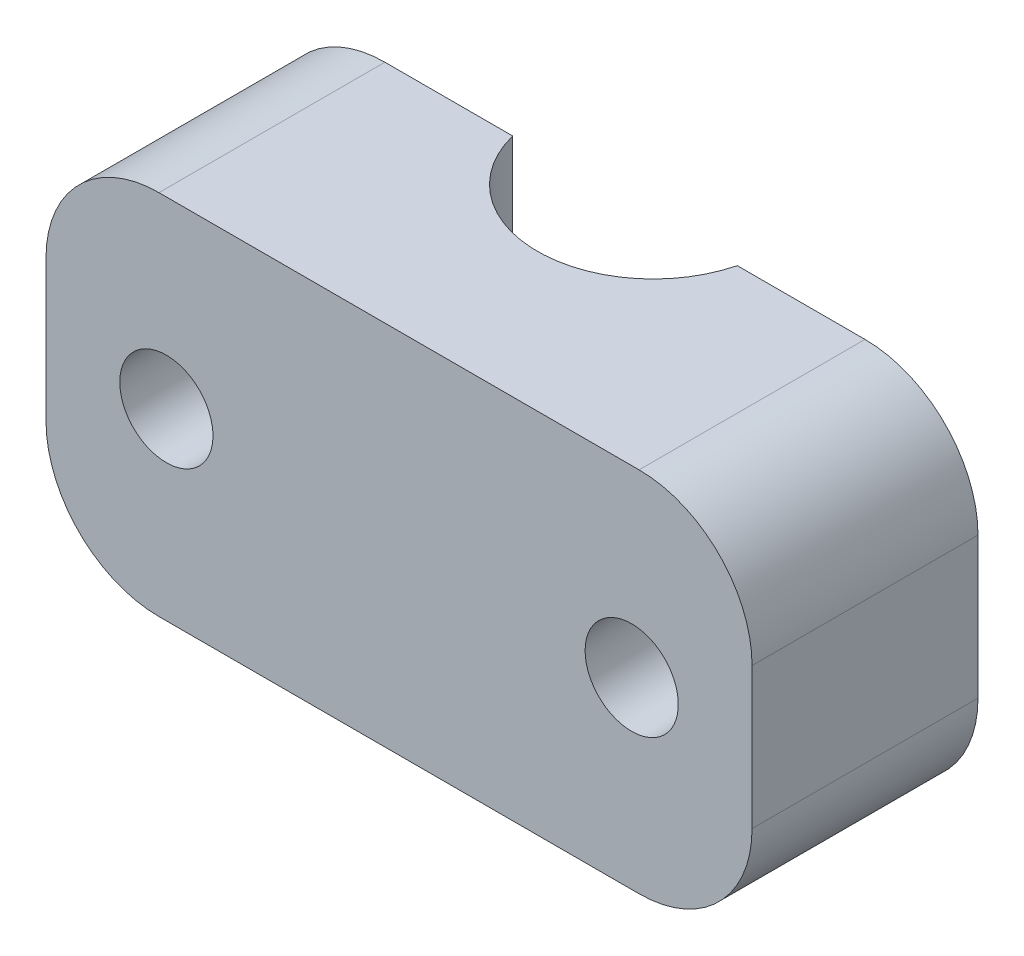
ISO-10303-21;
HEADER;
FILE_DESCRIPTION(('STEP AP214'),'2;1');
FILE_NAME('part.step','',(''),(''),'','','');
FILE_SCHEMA(('AUTOMOTIVE_DESIGN { 1 0 10303 214 1 1 1 1 }'));
ENDSEC;
DATA;
#1=APPLICATION_CONTEXT('core data for automotive mechanical design processes');
#2=APPLICATION_PROTOCOL_DEFINITION('international standard','automotive_design',2000,#1);
#3=PRODUCT_CONTEXT('',#1,'mechanical');
#4=PRODUCT('Part','Part','',(#3));
#5=PRODUCT_RELATED_PRODUCT_CATEGORY('part','',(#4));
#6=PRODUCT_DEFINITION_FORMATION('','',#4);
#7=PRODUCT_DEFINITION_CONTEXT('part definition',#1,'design');
#8=PRODUCT_DEFINITION('design','',#6,#7);
#9=PRODUCT_DEFINITION_SHAPE('','',#8);
#10=(LENGTH_UNIT() NAMED_UNIT(*) SI_UNIT(.MILLI.,.METRE.));
#11=(NAMED_UNIT(*) PLANE_ANGLE_UNIT() SI_UNIT($,.RADIAN.));
#12=(NAMED_UNIT(*) SI_UNIT($,.STERADIAN.) SOLID_ANGLE_UNIT());
#13=UNCERTAINTY_MEASURE_WITH_UNIT(LENGTH_MEASURE(1.E-05),#10,'distance_accuracy_value','');
#14=(GEOMETRIC_REPRESENTATION_CONTEXT(3) GLOBAL_UNCERTAINTY_ASSIGNED_CONTEXT((#13)) GLOBAL_UNIT_ASSIGNED_CONTEXT((#10,
#11,#12)) REPRESENTATION_CONTEXT('',''));
#15=CARTESIAN_POINT('',(0.,0.,0.));
#16=DIRECTION('',(0.,0.,1.));
#17=DIRECTION('',(1.,0.,0.));
#18=AXIS2_PLACEMENT_3D('',#15,#16,#17);
#19=CARTESIAN_POINT('',(-12.5,13.,-4.));
#20=DIRECTION('',(0.,0.,1.));
#21=DIRECTION('',(1.,0.,0.));
#22=AXIS2_PLACEMENT_3D('',#19,#20,#21);
#23=PLANE('',#22);
#24=CARTESIAN_POINT('',(8.23808953520711,6.5,-4.));
#25=DIRECTION('',(0.,0.,-1.));
#26=DIRECTION('',(-1.,0.,0.));
#27=AXIS2_PLACEMENT_3D('',#24,#25,#26);
#28=CIRCLE('',#27,1.65);
#29=CARTESIAN_POINT('',(6.5880895352071,6.5,-4.));
#30=VERTEX_POINT('',#29);
#31=EDGE_CURVE('E255',#30,#30,#28,.T.);
#32=ORIENTED_EDGE('',*,*,#31,.F.);
#33=EDGE_LOOP('',(#32));
#34=FACE_BOUND('',#33,.T.);
#35=DIRECTION('',(-1.,0.,0.));
#36=VECTOR('',#35,1.);
#37=CARTESIAN_POINT('',(-12.5,13.,-4.));
#38=LINE('',#37,#36);
#39=CARTESIAN_POINT('',(8.5,13.,-4.));
#40=VERTEX_POINT('',#39);
#41=CARTESIAN_POINT('',(3.97617907041421,13.,-4.));
#42=VERTEX_POINT('',#41);
#43=EDGE_CURVE('E250',#40,#42,#38,.T.);
#44=ORIENTED_EDGE('',*,*,#43,.F.);
#45=CARTESIAN_POINT('',(8.5,9.,-4.));
#46=DIRECTION('',(0.,0.,1.));
#47=DIRECTION('',(1.,0.,0.));
#48=AXIS2_PLACEMENT_3D('',#45,#46,#47);
#49=CIRCLE('',#48,4.);
#50=CARTESIAN_POINT('',(12.5,9.,-4.));
#51=VERTEX_POINT('',#50);
#52=EDGE_CURVE('E62',#40,#51,#49,.F.);
#53=ORIENTED_EDGE('',*,*,#52,.T.);
#54=DIRECTION('',(0.,-1.,0.));
#55=VECTOR('',#54,1.);
#56=CARTESIAN_POINT('',(12.5,13.,-4.));
#57=LINE('',#56,#55);
#58=CARTESIAN_POINT('',(12.5,4.,-4.));
#59=VERTEX_POINT('',#58);
#60=EDGE_CURVE('E130',#51,#59,#57,.T.);
#61=ORIENTED_EDGE('',*,*,#60,.T.);
#62=CARTESIAN_POINT('',(8.5,4.,-4.));
#63=DIRECTION('',(0.,0.,1.));
#64=DIRECTION('',(1.,0.,0.));
#65=AXIS2_PLACEMENT_3D('',#62,#63,#64);
#66=CIRCLE('',#65,4.);
#67=CARTESIAN_POINT('',(8.5,0.,-4.));
#68=VERTEX_POINT('',#67);
#69=EDGE_CURVE('E54',#59,#68,#66,.F.);
#70=ORIENTED_EDGE('',*,*,#69,.T.);
#71=DIRECTION('',(-1.,0.,0.));
#72=VECTOR('',#71,1.);
#73=CARTESIAN_POINT('',(-12.5,0.,-4.));
#74=LINE('',#73,#72);
#75=CARTESIAN_POINT('',(3.97617907041421,0.,-4.));
#76=VERTEX_POINT('',#75);
#77=EDGE_CURVE('E148',#68,#76,#74,.T.);
#78=ORIENTED_EDGE('',*,*,#77,.T.);
#79=DIRECTION('',(0.,1.,0.));
#80=VECTOR('',#79,1.);
#81=CARTESIAN_POINT('',(3.97617907041421,0.,-4.));
#82=LINE('',#81,#80);
#83=EDGE_CURVE('E124',#76,#42,#82,.T.);
#84=ORIENTED_EDGE('',*,*,#83,.T.);
#85=EDGE_LOOP('',(#44,#53,#61,#70,#78,#84));
#86=FACE_BOUND('',#85,.T.);
#87=ADVANCED_FACE('F38',(#34,#86),#23,.F.);
#88=CARTESIAN_POINT('',(12.5,13.,4.));
#89=DIRECTION('',(-1.,0.,0.));
#90=DIRECTION('',(0.,0.,1.));
#91=AXIS2_PLACEMENT_3D('',#88,#89,#90);
#92=PLANE('',#91);
#93=ORIENTED_EDGE('',*,*,#60,.F.);
#94=DIRECTION('',(0.,0.,-1.));
#95=VECTOR('',#94,1.);
#96=CARTESIAN_POINT('',(12.5,9.,4.));
#97=LINE('',#96,#95);
#98=CARTESIAN_POINT('',(12.5,9.,4.));
#99=VERTEX_POINT('',#98);
#100=EDGE_CURVE('E11',#51,#99,#97,.F.);
#101=ORIENTED_EDGE('',*,*,#100,.T.);
#102=DIRECTION('',(0.,-1.,0.));
#103=VECTOR('',#102,1.);
#104=CARTESIAN_POINT('',(12.5,13.,4.));
#105=LINE('',#104,#103);
#106=CARTESIAN_POINT('',(12.5,4.,4.));
#107=VERTEX_POINT('',#106);
#108=EDGE_CURVE('E161',#99,#107,#105,.T.);
#109=ORIENTED_EDGE('',*,*,#108,.T.);
#110=DIRECTION('',(0.,0.,-1.));
#111=VECTOR('',#110,1.);
#112=CARTESIAN_POINT('',(12.5,4.,-4.));
#113=LINE('',#112,#111);
#114=EDGE_CURVE('E47',#107,#59,#113,.T.);
#115=ORIENTED_EDGE('',*,*,#114,.T.);
#116=EDGE_LOOP('',(#93,#101,#109,#115));
#117=FACE_BOUND('',#116,.T.);
#118=ADVANCED_FACE('F226',(#117),#92,.F.);
#119=CARTESIAN_POINT('',(-8.23808953520711,6.5,-4.));
#120=DIRECTION('',(0.,0.,-1.));
#121=DIRECTION('',(-1.,0.,0.));
#122=AXIS2_PLACEMENT_3D('',#119,#120,#121);
#123=CIRCLE('',#122,1.65);
#124=CARTESIAN_POINT('',(-9.88808953520711,6.5,-4.));
#125=VERTEX_POINT('',#124);
#126=EDGE_CURVE('E180',#125,#125,#123,.T.);
#127=ORIENTED_EDGE('',*,*,#126,.F.);
#128=EDGE_LOOP('',(#127));
#129=FACE_BOUND('',#128,.T.);
#130=CARTESIAN_POINT('',(-3.97617907041421,0.,-4.));
#131=VERTEX_POINT('',#130);
#132=CARTESIAN_POINT('',(-8.5,0.,-4.));
#133=VERTEX_POINT('',#132);
#134=EDGE_CURVE('E136',#131,#133,#74,.T.);
#135=ORIENTED_EDGE('',*,*,#134,.T.);
#136=CARTESIAN_POINT('',(-8.5,4.,-4.));
#137=DIRECTION('',(0.,0.,1.));
#138=DIRECTION('',(1.,0.,0.));
#139=AXIS2_PLACEMENT_3D('',#136,#137,#138);
#140=CIRCLE('',#139,4.);
#141=CARTESIAN_POINT('',(-12.5,4.,-4.));
#142=VERTEX_POINT('',#141);
#143=EDGE_CURVE('E210',#133,#142,#140,.F.);
#144=ORIENTED_EDGE('',*,*,#143,.T.);
#145=DIRECTION('',(0.,-1.,0.));
#146=VECTOR('',#145,1.);
#147=CARTESIAN_POINT('',(-12.5,13.,-4.));
#148=LINE('',#147,#146);
#149=CARTESIAN_POINT('',(-12.5,9.,-4.));
#150=VERTEX_POINT('',#149);
#151=EDGE_CURVE('E169',#150,#142,#148,.T.);
#152=ORIENTED_EDGE('',*,*,#151,.F.);
#153=CARTESIAN_POINT('',(-8.5,9.,-4.));
#154=DIRECTION('',(0.,0.,1.));
#155=DIRECTION('',(1.,0.,0.));
#156=AXIS2_PLACEMENT_3D('',#153,#154,#155);
#157=CIRCLE('',#156,4.);
#158=CARTESIAN_POINT('',(-8.5,13.,-4.));
#159=VERTEX_POINT('',#158);
#160=EDGE_CURVE('E207',#150,#159,#157,.F.);
#161=ORIENTED_EDGE('',*,*,#160,.T.);
#162=CARTESIAN_POINT('',(-3.97617907041421,13.,-4.));
#163=VERTEX_POINT('',#162);
#164=EDGE_CURVE('E139',#163,#159,#38,.T.);
#165=ORIENTED_EDGE('',*,*,#164,.F.);
#166=DIRECTION('',(0.,1.,0.));
#167=VECTOR('',#166,1.);
#168=CARTESIAN_POINT('',(-3.97617907041421,0.,-4.));
#169=LINE('',#168,#167);
#170=EDGE_CURVE('E121',#163,#131,#169,.F.);
#171=ORIENTED_EDGE('',*,*,#170,.T.);
#172=EDGE_LOOP('',(#135,#144,#152,#161,#165,#171));
#173=FACE_BOUND('',#172,.T.);
#174=ADVANCED_FACE('F135',(#129,#173),#23,.F.);
#175=CARTESIAN_POINT('',(-12.5,13.,4.));
#176=DIRECTION('',(1.,0.,0.));
#177=DIRECTION('',(0.,0.,-1.));
#178=AXIS2_PLACEMENT_3D('',#175,#176,#177);
#179=PLANE('',#178);
#180=ORIENTED_EDGE('',*,*,#151,.T.);
#181=DIRECTION('',(0.,0.,1.));
#182=VECTOR('',#181,1.);
#183=CARTESIAN_POINT('',(-12.5,4.,4.));
#184=LINE('',#183,#182);
#185=CARTESIAN_POINT('',(-12.5,4.,4.));
#186=VERTEX_POINT('',#185);
#187=EDGE_CURVE('E186',#142,#186,#184,.T.);
#188=ORIENTED_EDGE('',*,*,#187,.T.);
#189=DIRECTION('',(0.,-1.,0.));
#190=VECTOR('',#189,1.);
#191=CARTESIAN_POINT('',(-12.5,13.,4.));
#192=LINE('',#191,#190);
#193=CARTESIAN_POINT('',(-12.5,9.,4.));
#194=VERTEX_POINT('',#193);
#195=EDGE_CURVE('E165',#194,#186,#192,.T.);
#196=ORIENTED_EDGE('',*,*,#195,.F.);
#197=DIRECTION('',(0.,0.,1.));
#198=VECTOR('',#197,1.);
#199=CARTESIAN_POINT('',(-12.5,9.,4.));
#200=LINE('',#199,#198);
#201=EDGE_CURVE('E129',#194,#150,#200,.F.);
#202=ORIENTED_EDGE('',*,*,#201,.T.);
#203=EDGE_LOOP('',(#180,#188,#196,#202));
#204=FACE_BOUND('',#203,.T.);
#205=ADVANCED_FACE('F239',(#204),#179,.F.);
#206=CARTESIAN_POINT('',(-12.5,13.,4.));
#207=DIRECTION('',(0.,0.,-1.));
#208=DIRECTION('',(-1.,0.,0.));
#209=AXIS2_PLACEMENT_3D('',#206,#207,#208);
#210=PLANE('',#209);
#211=CARTESIAN_POINT('',(-8.23808953520711,6.5,4.));
#212=DIRECTION('',(0.,0.,-1.));
#213=DIRECTION('',(-1.,0.,0.));
#214=AXIS2_PLACEMENT_3D('',#211,#212,#213);
#215=CIRCLE('',#214,1.65);
#216=CARTESIAN_POINT('',(-9.88808953520711,6.5,4.));
#217=VERTEX_POINT('',#216);
#218=EDGE_CURVE('E179',#217,#217,#215,.T.);
#219=ORIENTED_EDGE('',*,*,#218,.T.);
#220=EDGE_LOOP('',(#219));
#221=FACE_BOUND('',#220,.T.);
#222=CARTESIAN_POINT('',(8.23808953520711,6.5,4.));
#223=DIRECTION('',(0.,0.,-1.));
#224=DIRECTION('',(-1.,0.,0.));
#225=AXIS2_PLACEMENT_3D('',#222,#223,#224);
#226=CIRCLE('',#225,1.65);
#227=CARTESIAN_POINT('',(6.5880895352071,6.5,4.));
#228=VERTEX_POINT('',#227);
#229=EDGE_CURVE('E175',#228,#228,#226,.T.);
#230=ORIENTED_EDGE('',*,*,#229,.T.);
#231=EDGE_LOOP('',(#230));
#232=FACE_BOUND('',#231,.T.);
#233=ORIENTED_EDGE('',*,*,#195,.T.);
#234=CARTESIAN_POINT('',(-8.5,4.,4.));
#235=DIRECTION('',(0.,0.,-1.));
#236=DIRECTION('',(-1.,0.,0.));
#237=AXIS2_PLACEMENT_3D('',#234,#235,#236);
#238=CIRCLE('',#237,4.);
#239=CARTESIAN_POINT('',(-8.5,0.,4.));
#240=VERTEX_POINT('',#239);
#241=EDGE_CURVE('E199',#186,#240,#238,.F.);
#242=ORIENTED_EDGE('',*,*,#241,.T.);
#243=DIRECTION('',(1.,0.,0.));
#244=VECTOR('',#243,1.);
#245=CARTESIAN_POINT('',(-12.5,0.,4.));
#246=LINE('',#245,#244);
#247=CARTESIAN_POINT('',(8.5,0.,4.));
#248=VERTEX_POINT('',#247);
#249=EDGE_CURVE('E152',#240,#248,#246,.T.);
#250=ORIENTED_EDGE('',*,*,#249,.T.);
#251=CARTESIAN_POINT('',(8.5,4.,4.));
#252=DIRECTION('',(0.,0.,-1.));
#253=DIRECTION('',(-1.,0.,0.));
#254=AXIS2_PLACEMENT_3D('',#251,#252,#253);
#255=CIRCLE('',#254,4.);
#256=EDGE_CURVE('E190',#248,#107,#255,.F.);
#257=ORIENTED_EDGE('',*,*,#256,.T.);
#258=ORIENTED_EDGE('',*,*,#108,.F.);
#259=CARTESIAN_POINT('',(8.5,9.,4.));
#260=DIRECTION('',(0.,0.,-1.));
#261=DIRECTION('',(-1.,0.,0.));
#262=AXIS2_PLACEMENT_3D('',#259,#260,#261);
#263=CIRCLE('',#262,4.);
#264=CARTESIAN_POINT('',(8.5,13.,4.));
#265=VERTEX_POINT('',#264);
#266=EDGE_CURVE('E193',#99,#265,#263,.F.);
#267=ORIENTED_EDGE('',*,*,#266,.T.);
#268=DIRECTION('',(1.,0.,0.));
#269=VECTOR('',#268,1.);
#270=CARTESIAN_POINT('',(-12.5,13.,4.));
#271=LINE('',#270,#269);
#272=CARTESIAN_POINT('',(-8.5,13.,4.));
#273=VERTEX_POINT('',#272);
#274=EDGE_CURVE('E156',#273,#265,#271,.T.);
#275=ORIENTED_EDGE('',*,*,#274,.F.);
#276=CARTESIAN_POINT('',(-8.5,9.,4.));
#277=DIRECTION('',(0.,0.,-1.));
#278=DIRECTION('',(-1.,0.,0.));
#279=AXIS2_PLACEMENT_3D('',#276,#277,#278);
#280=CIRCLE('',#279,4.);
#281=EDGE_CURVE('E196',#273,#194,#280,.F.);
#282=ORIENTED_EDGE('',*,*,#281,.T.);
#283=EDGE_LOOP('',(#233,#242,#250,#257,#258,#267,#275,#282));
#284=FACE_BOUND('',#283,.T.);
#285=ADVANCED_FACE('F231',(#221,#232,#284),#210,.F.);
#286=CARTESIAN_POINT('',(0.,13.,0.));
#287=DIRECTION('',(0.,-1.,0.));
#288=DIRECTION('',(0.,0.,-1.));
#289=AXIS2_PLACEMENT_3D('',#286,#287,#288);
#290=PLANE('',#289);
#291=ORIENTED_EDGE('',*,*,#164,.T.);
#292=DIRECTION('',(0.,0.,1.));
#293=VECTOR('',#292,1.);
#294=CARTESIAN_POINT('',(-8.5,13.,0.));
#295=LINE('',#294,#293);
#296=EDGE_CURVE('E217',#159,#273,#295,.T.);
#297=ORIENTED_EDGE('',*,*,#296,.T.);
#298=ORIENTED_EDGE('',*,*,#274,.T.);
#299=DIRECTION('',(0.,0.,-1.));
#300=VECTOR('',#299,1.);
#301=CARTESIAN_POINT('',(8.5,13.,0.));
#302=LINE('',#301,#300);
#303=EDGE_CURVE('E213',#265,#40,#302,.T.);
#304=ORIENTED_EDGE('',*,*,#303,.T.);
#305=ORIENTED_EDGE('',*,*,#43,.T.);
#306=CARTESIAN_POINT('',(0.,13.,-5.));
#307=DIRECTION('',(0.,1.,0.));
#308=DIRECTION('',(0.,0.,1.));
#309=AXIS2_PLACEMENT_3D('',#306,#307,#308);
#310=CIRCLE('',#309,4.1);
#311=EDGE_CURVE('E141',#163,#42,#310,.T.);
#312=ORIENTED_EDGE('',*,*,#311,.F.);
#313=EDGE_LOOP('',(#291,#297,#298,#304,#305,#312));
#314=FACE_BOUND('',#313,.T.);
#315=ADVANCED_FACE('F246',(#314),#290,.F.);
#316=CARTESIAN_POINT('',(0.,0.,0.));
#317=DIRECTION('',(0.,-1.,0.));
#318=DIRECTION('',(0.,0.,-1.));
#319=AXIS2_PLACEMENT_3D('',#316,#317,#318);
#320=PLANE('',#319);
#321=ORIENTED_EDGE('',*,*,#249,.F.);
#322=DIRECTION('',(0.,0.,1.));
#323=VECTOR('',#322,1.);
#324=CARTESIAN_POINT('',(-8.5,0.,-4.));
#325=LINE('',#324,#323);
#326=EDGE_CURVE('E146',#240,#133,#325,.F.);
#327=ORIENTED_EDGE('',*,*,#326,.T.);
#328=ORIENTED_EDGE('',*,*,#134,.F.);
#329=CARTESIAN_POINT('',(0.,0.,-5.));
#330=DIRECTION('',(0.,-1.,0.));
#331=DIRECTION('',(0.,0.,-1.));
#332=AXIS2_PLACEMENT_3D('',#329,#330,#331);
#333=CIRCLE('',#332,4.1);
#334=EDGE_CURVE('E117',#76,#131,#333,.T.);
#335=ORIENTED_EDGE('',*,*,#334,.F.);
#336=ORIENTED_EDGE('',*,*,#77,.F.);
#337=DIRECTION('',(0.,0.,-1.));
#338=VECTOR('',#337,1.);
#339=CARTESIAN_POINT('',(8.5,0.,4.));
#340=LINE('',#339,#338);
#341=EDGE_CURVE('E202',#68,#248,#340,.F.);
#342=ORIENTED_EDGE('',*,*,#341,.T.);
#343=EDGE_LOOP('',(#321,#327,#328,#335,#336,#342));
#344=FACE_BOUND('',#343,.T.);
#345=ADVANCED_FACE('F144',(#344),#320,.T.);
#346=CARTESIAN_POINT('',(0.,0.,-5.));
#347=DIRECTION('',(0.,1.,0.));
#348=DIRECTION('',(0.,0.,1.));
#349=AXIS2_PLACEMENT_3D('',#346,#347,#348);
#350=CYLINDRICAL_SURFACE('',#349,4.1);
#351=ORIENTED_EDGE('',*,*,#334,.T.);
#352=ORIENTED_EDGE('',*,*,#170,.F.);
#353=ORIENTED_EDGE('',*,*,#311,.T.);
#354=ORIENTED_EDGE('',*,*,#83,.F.);
#355=EDGE_LOOP('',(#351,#352,#353,#354));
#356=FACE_BOUND('',#355,.T.);
#357=ADVANCED_FACE('F119',(#356),#350,.F.);
#358=CARTESIAN_POINT('',(8.23808953520711,6.5,6.));
#359=DIRECTION('',(0.,0.,-1.));
#360=DIRECTION('',(-1.,0.,0.));
#361=AXIS2_PLACEMENT_3D('',#358,#359,#360);
#362=CYLINDRICAL_SURFACE('',#361,1.65);
#363=ORIENTED_EDGE('',*,*,#31,.T.);
#364=EDGE_LOOP('',(#363));
#365=FACE_BOUND('',#364,.T.);
#366=ORIENTED_EDGE('',*,*,#229,.F.);
#367=EDGE_LOOP('',(#366));
#368=FACE_BOUND('',#367,.T.);
#369=ADVANCED_FACE('F280',(#365,#368),#362,.F.);
#370=CARTESIAN_POINT('',(-8.23808953520711,6.5,6.));
#371=DIRECTION('',(0.,0.,-1.));
#372=DIRECTION('',(-1.,0.,0.));
#373=AXIS2_PLACEMENT_3D('',#370,#371,#372);
#374=CYLINDRICAL_SURFACE('',#373,1.65);
#375=ORIENTED_EDGE('',*,*,#126,.T.);
#376=EDGE_LOOP('',(#375));
#377=FACE_BOUND('',#376,.T.);
#378=ORIENTED_EDGE('',*,*,#218,.F.);
#379=EDGE_LOOP('',(#378));
#380=FACE_BOUND('',#379,.T.);
#381=ADVANCED_FACE('F263',(#377,#380),#374,.F.);
#382=CARTESIAN_POINT('',(-8.5,4.,4.));
#383=DIRECTION('',(0.,0.,-1.));
#384=DIRECTION('',(-1.,0.,0.));
#385=AXIS2_PLACEMENT_3D('',#382,#383,#384);
#386=CYLINDRICAL_SURFACE('',#385,4.);
#387=ORIENTED_EDGE('',*,*,#143,.F.);
#388=ORIENTED_EDGE('',*,*,#326,.F.);
#389=ORIENTED_EDGE('',*,*,#241,.F.);
#390=ORIENTED_EDGE('',*,*,#187,.F.);
#391=EDGE_LOOP('',(#387,#388,#389,#390));
#392=FACE_BOUND('',#391,.T.);
#393=ADVANCED_FACE('F234',(#392),#386,.T.);
#394=CARTESIAN_POINT('',(-8.5,9.,0.));
#395=DIRECTION('',(0.,0.,1.));
#396=DIRECTION('',(1.,0.,0.));
#397=AXIS2_PLACEMENT_3D('',#394,#395,#396);
#398=CYLINDRICAL_SURFACE('',#397,4.);
#399=ORIENTED_EDGE('',*,*,#160,.F.);
#400=ORIENTED_EDGE('',*,*,#201,.F.);
#401=ORIENTED_EDGE('',*,*,#281,.F.);
#402=ORIENTED_EDGE('',*,*,#296,.F.);
#403=EDGE_LOOP('',(#399,#400,#401,#402));
#404=FACE_BOUND('',#403,.T.);
#405=ADVANCED_FACE('F243',(#404),#398,.T.);
#406=CARTESIAN_POINT('',(8.5,9.,0.));
#407=DIRECTION('',(0.,0.,-1.));
#408=DIRECTION('',(-1.,0.,0.));
#409=AXIS2_PLACEMENT_3D('',#406,#407,#408);
#410=CYLINDRICAL_SURFACE('',#409,4.);
#411=ORIENTED_EDGE('',*,*,#266,.F.);
#412=ORIENTED_EDGE('',*,*,#100,.F.);
#413=ORIENTED_EDGE('',*,*,#52,.F.);
#414=ORIENTED_EDGE('',*,*,#303,.F.);
#415=EDGE_LOOP('',(#411,#412,#413,#414));
#416=FACE_BOUND('',#415,.T.);
#417=ADVANCED_FACE('F306',(#416),#410,.T.);
#418=CARTESIAN_POINT('',(8.5,4.,4.));
#419=DIRECTION('',(0.,0.,1.));
#420=DIRECTION('',(1.,0.,0.));
#421=AXIS2_PLACEMENT_3D('',#418,#419,#420);
#422=CYLINDRICAL_SURFACE('',#421,4.);
#423=ORIENTED_EDGE('',*,*,#256,.F.);
#424=ORIENTED_EDGE('',*,*,#341,.F.);
#425=ORIENTED_EDGE('',*,*,#69,.F.);
#426=ORIENTED_EDGE('',*,*,#114,.F.);
#427=EDGE_LOOP('',(#423,#424,#425,#426));
#428=FACE_BOUND('',#427,.T.);
#429=ADVANCED_FACE('F40',(#428),#422,.T.);
#430=CLOSED_SHELL('',(#87,#118,#174,#205,#285,#315,#345,#357,#369,#381,#393,#405,#417,#429));
#431=MANIFOLD_SOLID_BREP('B2',#430);
#432=ADVANCED_BREP_SHAPE_REPRESENTATION('',(#18,#431),#14);
#433=SHAPE_DEFINITION_REPRESENTATION(#9,#432);
ENDSEC;
END-ISO-10303-21;
